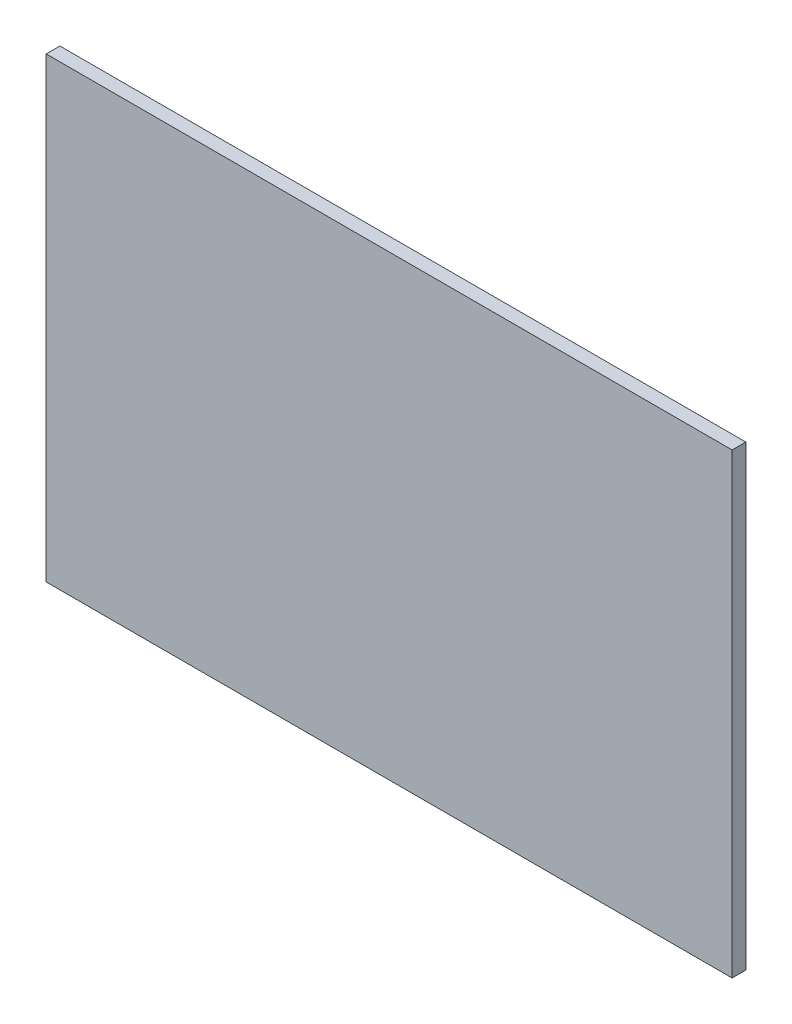
ISO-10303-21;
HEADER;
FILE_DESCRIPTION(('STEP AP214'),'2;1');
FILE_NAME('part.step','',(''),(''),'','','');
FILE_SCHEMA(('AUTOMOTIVE_DESIGN { 1 0 10303 214 1 1 1 1 }'));
ENDSEC;
DATA;
#1=APPLICATION_CONTEXT('core data for automotive mechanical design processes');
#2=APPLICATION_PROTOCOL_DEFINITION('international standard','automotive_design',2000,#1);
#3=PRODUCT_CONTEXT('',#1,'mechanical');
#4=PRODUCT('Part','Part','',(#3));
#5=PRODUCT_RELATED_PRODUCT_CATEGORY('part','',(#4));
#6=PRODUCT_DEFINITION_FORMATION('','',#4);
#7=PRODUCT_DEFINITION_CONTEXT('part definition',#1,'design');
#8=PRODUCT_DEFINITION('design','',#6,#7);
#9=PRODUCT_DEFINITION_SHAPE('','',#8);
#10=(LENGTH_UNIT() NAMED_UNIT(*) SI_UNIT(.MILLI.,.METRE.));
#11=(NAMED_UNIT(*) PLANE_ANGLE_UNIT() SI_UNIT($,.RADIAN.));
#12=(NAMED_UNIT(*) SI_UNIT($,.STERADIAN.) SOLID_ANGLE_UNIT());
#13=UNCERTAINTY_MEASURE_WITH_UNIT(LENGTH_MEASURE(1.E-05),#10,'distance_accuracy_value','');
#14=(GEOMETRIC_REPRESENTATION_CONTEXT(3) GLOBAL_UNCERTAINTY_ASSIGNED_CONTEXT((#13)) GLOBAL_UNIT_ASSIGNED_CONTEXT((#10,
#11,#12)) REPRESENTATION_CONTEXT('',''));
#15=CARTESIAN_POINT('',(0.,0.,0.));
#16=DIRECTION('',(0.,0.,1.));
#17=DIRECTION('',(1.,0.,0.));
#18=AXIS2_PLACEMENT_3D('',#15,#16,#17);
#19=CARTESIAN_POINT('',(-75.,44.5419847328244,3.));
#20=DIRECTION('',(1.,0.,0.));
#21=DIRECTION('',(0.,1.,0.));
#22=AXIS2_PLACEMENT_3D('',#19,#20,#21);
#23=PLANE('',#22);
#24=DIRECTION('',(0.,-1.,0.));
#25=VECTOR('',#24,1.);
#26=CARTESIAN_POINT('',(-75.,44.5419847328244,0.));
#27=LINE('',#26,#25);
#28=CARTESIAN_POINT('',(-75.,44.5419847328244,0.));
#29=VERTEX_POINT('',#28);
#30=CARTESIAN_POINT('',(-75.,-55.4580152671756,0.));
#31=VERTEX_POINT('',#30);
#32=EDGE_CURVE('E107',#29,#31,#27,.T.);
#33=ORIENTED_EDGE('',*,*,#32,.T.);
#34=DIRECTION('',(0.,0.,-1.));
#35=VECTOR('',#34,1.);
#36=CARTESIAN_POINT('',(-75.,-55.4580152671756,3.));
#37=LINE('',#36,#35);
#38=CARTESIAN_POINT('',(-75.,-55.4580152671756,3.));
#39=VERTEX_POINT('',#38);
#40=EDGE_CURVE('E11',#39,#31,#37,.T.);
#41=ORIENTED_EDGE('',*,*,#40,.F.);
#42=DIRECTION('',(0.,-1.,0.));
#43=VECTOR('',#42,1.);
#44=CARTESIAN_POINT('',(-75.,44.5419847328244,3.));
#45=LINE('',#44,#43);
#46=CARTESIAN_POINT('',(-75.,44.5419847328244,3.));
#47=VERTEX_POINT('',#46);
#48=EDGE_CURVE('E91',#47,#39,#45,.T.);
#49=ORIENTED_EDGE('',*,*,#48,.F.);
#50=DIRECTION('',(0.,0.,-1.));
#51=VECTOR('',#50,1.);
#52=CARTESIAN_POINT('',(-75.,44.5419847328244,3.));
#53=LINE('',#52,#51);
#54=EDGE_CURVE('E103',#47,#29,#53,.T.);
#55=ORIENTED_EDGE('',*,*,#54,.T.);
#56=EDGE_LOOP('',(#33,#41,#49,#55));
#57=FACE_BOUND('',#56,.T.);
#58=ADVANCED_FACE('F39',(#57),#23,.F.);
#59=CARTESIAN_POINT('',(-75.,-55.4580152671756,3.));
#60=DIRECTION('',(0.,1.,0.));
#61=DIRECTION('',(0.,0.,1.));
#62=AXIS2_PLACEMENT_3D('',#59,#60,#61);
#63=PLANE('',#62);
#64=DIRECTION('',(1.,0.,0.));
#65=VECTOR('',#64,1.);
#66=CARTESIAN_POINT('',(-75.,-55.4580152671756,0.));
#67=LINE('',#66,#65);
#68=CARTESIAN_POINT('',(75.,-55.4580152671756,0.));
#69=VERTEX_POINT('',#68);
#70=EDGE_CURVE('E96',#31,#69,#67,.T.);
#71=ORIENTED_EDGE('',*,*,#70,.T.);
#72=DIRECTION('',(0.,0.,-1.));
#73=VECTOR('',#72,1.);
#74=CARTESIAN_POINT('',(75.,-55.4580152671756,3.));
#75=LINE('',#74,#73);
#76=CARTESIAN_POINT('',(75.,-55.4580152671756,3.));
#77=VERTEX_POINT('',#76);
#78=EDGE_CURVE('E48',#77,#69,#75,.T.);
#79=ORIENTED_EDGE('',*,*,#78,.F.);
#80=DIRECTION('',(1.,0.,0.));
#81=VECTOR('',#80,1.);
#82=CARTESIAN_POINT('',(-75.,-55.4580152671756,3.));
#83=LINE('',#82,#81);
#84=EDGE_CURVE('E86',#39,#77,#83,.T.);
#85=ORIENTED_EDGE('',*,*,#84,.F.);
#86=ORIENTED_EDGE('',*,*,#40,.T.);
#87=EDGE_LOOP('',(#71,#79,#85,#86));
#88=FACE_BOUND('',#87,.T.);
#89=ADVANCED_FACE('F95',(#88),#63,.F.);
#90=CARTESIAN_POINT('',(75.,44.5419847328244,3.));
#91=DIRECTION('',(-1.,0.,0.));
#92=DIRECTION('',(0.,0.,1.));
#93=AXIS2_PLACEMENT_3D('',#90,#91,#92);
#94=PLANE('',#93);
#95=DIRECTION('',(0.,1.,0.));
#96=VECTOR('',#95,1.);
#97=CARTESIAN_POINT('',(75.,44.5419847328244,0.));
#98=LINE('',#97,#96);
#99=CARTESIAN_POINT('',(75.,44.5419847328244,0.));
#100=VERTEX_POINT('',#99);
#101=EDGE_CURVE('E73',#69,#100,#98,.T.);
#102=ORIENTED_EDGE('',*,*,#101,.T.);
#103=DIRECTION('',(0.,0.,-1.));
#104=VECTOR('',#103,1.);
#105=CARTESIAN_POINT('',(75.,44.5419847328244,3.));
#106=LINE('',#105,#104);
#107=CARTESIAN_POINT('',(75.,44.5419847328244,3.));
#108=VERTEX_POINT('',#107);
#109=EDGE_CURVE('E98',#108,#100,#106,.T.);
#110=ORIENTED_EDGE('',*,*,#109,.F.);
#111=DIRECTION('',(0.,1.,0.));
#112=VECTOR('',#111,1.);
#113=CARTESIAN_POINT('',(75.,44.5419847328244,3.));
#114=LINE('',#113,#112);
#115=EDGE_CURVE('E89',#77,#108,#114,.T.);
#116=ORIENTED_EDGE('',*,*,#115,.F.);
#117=ORIENTED_EDGE('',*,*,#78,.T.);
#118=EDGE_LOOP('',(#102,#110,#116,#117));
#119=FACE_BOUND('',#118,.T.);
#120=ADVANCED_FACE('F99',(#119),#94,.F.);
#121=CARTESIAN_POINT('',(-75.,44.5419847328244,3.));
#122=DIRECTION('',(0.,-1.,0.));
#123=DIRECTION('',(1.,0.,0.));
#124=AXIS2_PLACEMENT_3D('',#121,#122,#123);
#125=PLANE('',#124);
#126=DIRECTION('',(-1.,0.,0.));
#127=VECTOR('',#126,1.);
#128=CARTESIAN_POINT('',(-75.,44.5419847328244,0.));
#129=LINE('',#128,#127);
#130=EDGE_CURVE('E79',#100,#29,#129,.T.);
#131=ORIENTED_EDGE('',*,*,#130,.T.);
#132=ORIENTED_EDGE('',*,*,#54,.F.);
#133=DIRECTION('',(-1.,0.,0.));
#134=VECTOR('',#133,1.);
#135=CARTESIAN_POINT('',(-75.,44.5419847328244,3.));
#136=LINE('',#135,#134);
#137=EDGE_CURVE('E56',#108,#47,#136,.T.);
#138=ORIENTED_EDGE('',*,*,#137,.F.);
#139=ORIENTED_EDGE('',*,*,#109,.T.);
#140=EDGE_LOOP('',(#131,#132,#138,#139));
#141=FACE_BOUND('',#140,.T.);
#142=ADVANCED_FACE('F120',(#141),#125,.F.);
#143=CARTESIAN_POINT('',(0.,0.,3.));
#144=DIRECTION('',(0.,0.,1.));
#145=DIRECTION('',(1.,0.,0.));
#146=AXIS2_PLACEMENT_3D('',#143,#144,#145);
#147=PLANE('',#146);
#148=ORIENTED_EDGE('',*,*,#48,.T.);
#149=ORIENTED_EDGE('',*,*,#84,.T.);
#150=ORIENTED_EDGE('',*,*,#115,.T.);
#151=ORIENTED_EDGE('',*,*,#137,.T.);
#152=EDGE_LOOP('',(#148,#149,#150,#151));
#153=FACE_BOUND('',#152,.T.);
#154=ADVANCED_FACE('F87',(#153),#147,.T.);
#155=CARTESIAN_POINT('',(0.,0.,0.));
#156=DIRECTION('',(0.,0.,1.));
#157=DIRECTION('',(1.,0.,0.));
#158=AXIS2_PLACEMENT_3D('',#155,#156,#157);
#159=PLANE('',#158);
#160=ORIENTED_EDGE('',*,*,#32,.F.);
#161=ORIENTED_EDGE('',*,*,#130,.F.);
#162=ORIENTED_EDGE('',*,*,#101,.F.);
#163=ORIENTED_EDGE('',*,*,#70,.F.);
#164=EDGE_LOOP('',(#160,#161,#162,#163));
#165=FACE_BOUND('',#164,.T.);
#166=ADVANCED_FACE('F123',(#165),#159,.F.);
#167=CLOSED_SHELL('',(#58,#89,#120,#142,#154,#166));
#168=MANIFOLD_SOLID_BREP('B2',#167);
#169=ADVANCED_BREP_SHAPE_REPRESENTATION('',(#18,#168),#14);
#170=SHAPE_DEFINITION_REPRESENTATION(#9,#169);
ENDSEC;
END-ISO-10303-21;
